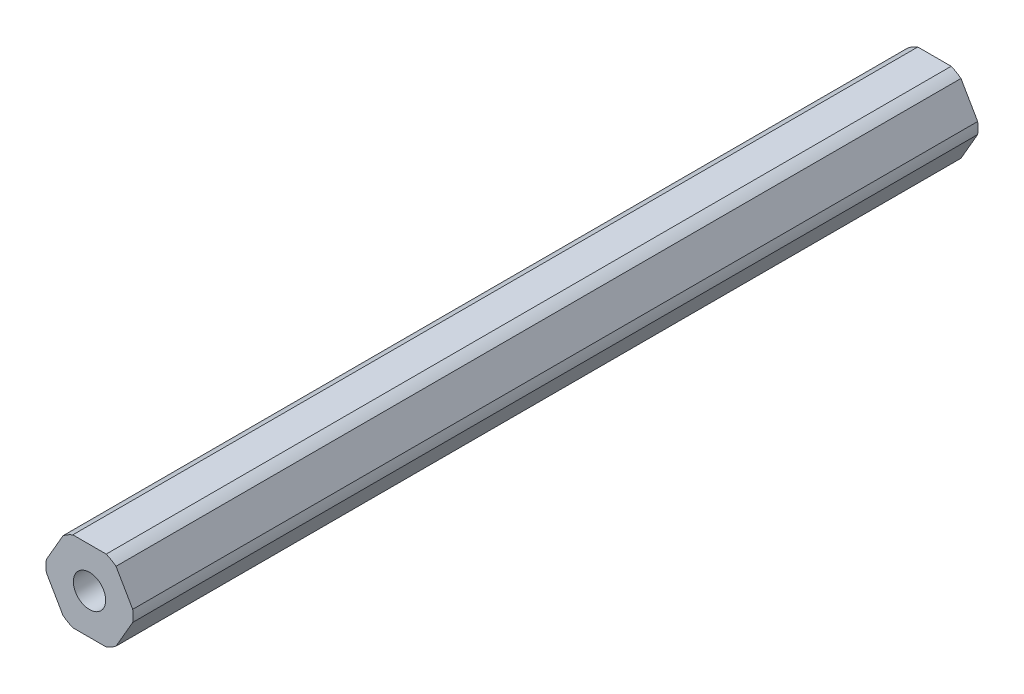
ISO-10303-21;
HEADER;
FILE_DESCRIPTION(('STEP AP214'),'2;1');
FILE_NAME('part.step','',(''),(''),'','','');
FILE_SCHEMA(('AUTOMOTIVE_DESIGN { 1 0 10303 214 1 1 1 1 }'));
ENDSEC;
DATA;
#1=APPLICATION_CONTEXT('core data for automotive mechanical design processes');
#2=APPLICATION_PROTOCOL_DEFINITION('international standard','automotive_design',2000,#1);
#3=PRODUCT_CONTEXT('',#1,'mechanical');
#4=PRODUCT('Part','Part','',(#3));
#5=PRODUCT_RELATED_PRODUCT_CATEGORY('part','',(#4));
#6=PRODUCT_DEFINITION_FORMATION('','',#4);
#7=PRODUCT_DEFINITION_CONTEXT('part definition',#1,'design');
#8=PRODUCT_DEFINITION('design','',#6,#7);
#9=PRODUCT_DEFINITION_SHAPE('','',#8);
#10=(LENGTH_UNIT() NAMED_UNIT(*) SI_UNIT(.MILLI.,.METRE.));
#11=(NAMED_UNIT(*) PLANE_ANGLE_UNIT() SI_UNIT($,.RADIAN.));
#12=(NAMED_UNIT(*) SI_UNIT($,.STERADIAN.) SOLID_ANGLE_UNIT());
#13=UNCERTAINTY_MEASURE_WITH_UNIT(LENGTH_MEASURE(1.E-05),#10,'distance_accuracy_value','');
#14=(GEOMETRIC_REPRESENTATION_CONTEXT(3) GLOBAL_UNCERTAINTY_ASSIGNED_CONTEXT((#13)) GLOBAL_UNIT_ASSIGNED_CONTEXT((#10,
#11,#12)) REPRESENTATION_CONTEXT('',''));
#15=CARTESIAN_POINT('',(0.,0.,0.));
#16=DIRECTION('',(0.,0.,1.));
#17=DIRECTION('',(1.,0.,0.));
#18=AXIS2_PLACEMENT_3D('',#15,#16,#17);
#19=CARTESIAN_POINT('',(0.,0.,133.35));
#20=DIRECTION('',(0.,0.,1.));
#21=DIRECTION('',(1.,0.,0.));
#22=AXIS2_PLACEMENT_3D('',#19,#20,#21);
#23=PLANE('',#22);
#24=CARTESIAN_POINT('',(0.,0.,133.35));
#25=DIRECTION('',(0.,0.,1.));
#26=DIRECTION('',(1.,0.,0.));
#27=AXIS2_PLACEMENT_3D('',#24,#25,#26);
#28=CIRCLE('',#27,6.875);
#29=CARTESIAN_POINT('',(-2.63498102459961,6.35,133.35));
#30=VERTEX_POINT('',#29);
#31=CARTESIAN_POINT('',(-4.18177080173138,5.45696050579321,133.35));
#32=VERTEX_POINT('',#31);
#33=EDGE_CURVE('E176',#30,#32,#28,.T.);
#34=ORIENTED_EDGE('',*,*,#33,.T.);
#35=DIRECTION('',(-0.5,-0.866025403784439,0.));
#36=VECTOR('',#35,1.);
#37=CARTESIAN_POINT('',(-4.18177080173138,5.45696050579321,133.35));
#38=LINE('',#37,#36);
#39=CARTESIAN_POINT('',(-6.81675182633099,0.893039494206796,133.35));
#40=VERTEX_POINT('',#39);
#41=EDGE_CURVE('E104',#32,#40,#38,.T.);
#42=ORIENTED_EDGE('',*,*,#41,.T.);
#43=CARTESIAN_POINT('',(0.,0.,133.35));
#44=DIRECTION('',(0.,0.,1.));
#45=DIRECTION('',(1.,0.,0.));
#46=AXIS2_PLACEMENT_3D('',#43,#44,#45);
#47=CIRCLE('',#46,6.875);
#48=CARTESIAN_POINT('',(-6.81675182633099,-0.893039494206789,133.35));
#49=VERTEX_POINT('',#48);
#50=EDGE_CURVE('E203',#40,#49,#47,.T.);
#51=ORIENTED_EDGE('',*,*,#50,.T.);
#52=DIRECTION('',(0.5,-0.866025403784438,0.));
#53=VECTOR('',#52,1.);
#54=CARTESIAN_POINT('',(-6.81675182633099,-0.893039494206789,133.35));
#55=LINE('',#54,#53);
#56=CARTESIAN_POINT('',(-4.18177080173138,-5.45696050579321,133.35));
#57=VERTEX_POINT('',#56);
#58=EDGE_CURVE('E222',#49,#57,#55,.T.);
#59=ORIENTED_EDGE('',*,*,#58,.T.);
#60=CARTESIAN_POINT('',(0.,0.,133.35));
#61=DIRECTION('',(0.,0.,1.));
#62=DIRECTION('',(1.,0.,0.));
#63=AXIS2_PLACEMENT_3D('',#60,#61,#62);
#64=CIRCLE('',#63,6.875);
#65=CARTESIAN_POINT('',(-2.63498102459961,-6.35,133.35));
#66=VERTEX_POINT('',#65);
#67=EDGE_CURVE('E219',#57,#66,#64,.T.);
#68=ORIENTED_EDGE('',*,*,#67,.T.);
#69=DIRECTION('',(1.,0.,0.));
#70=VECTOR('',#69,1.);
#71=CARTESIAN_POINT('',(-2.63498102459961,-6.35,133.35));
#72=LINE('',#71,#70);
#73=CARTESIAN_POINT('',(2.63498102459961,-6.35,133.35));
#74=VERTEX_POINT('',#73);
#75=EDGE_CURVE('E221',#66,#74,#72,.T.);
#76=ORIENTED_EDGE('',*,*,#75,.T.);
#77=CARTESIAN_POINT('',(0.,0.,133.35));
#78=DIRECTION('',(0.,0.,1.));
#79=DIRECTION('',(1.,0.,0.));
#80=AXIS2_PLACEMENT_3D('',#77,#78,#79);
#81=CIRCLE('',#80,6.875);
#82=CARTESIAN_POINT('',(4.18177080173138,-5.45696050579321,133.35));
#83=VERTEX_POINT('',#82);
#84=EDGE_CURVE('E224',#74,#83,#81,.T.);
#85=ORIENTED_EDGE('',*,*,#84,.T.);
#86=DIRECTION('',(0.5,0.866025403784439,0.));
#87=VECTOR('',#86,1.);
#88=CARTESIAN_POINT('',(4.18177080173138,-5.45696050579321,133.35));
#89=LINE('',#88,#87);
#90=CARTESIAN_POINT('',(6.81675182633099,-0.893039494206794,133.35));
#91=VERTEX_POINT('',#90);
#92=EDGE_CURVE('E230',#83,#91,#89,.T.);
#93=ORIENTED_EDGE('',*,*,#92,.T.);
#94=CARTESIAN_POINT('',(0.,0.,133.35));
#95=DIRECTION('',(0.,0.,1.));
#96=DIRECTION('',(1.,0.,0.));
#97=AXIS2_PLACEMENT_3D('',#94,#95,#96);
#98=CIRCLE('',#97,6.875);
#99=CARTESIAN_POINT('',(6.81675182633099,0.893039494206791,133.35));
#100=VERTEX_POINT('',#99);
#101=EDGE_CURVE('E135',#91,#100,#98,.T.);
#102=ORIENTED_EDGE('',*,*,#101,.T.);
#103=DIRECTION('',(-0.5,0.866025403784439,0.));
#104=VECTOR('',#103,1.);
#105=CARTESIAN_POINT('',(6.81675182633099,0.893039494206791,133.35));
#106=LINE('',#105,#104);
#107=CARTESIAN_POINT('',(4.18177080173138,5.45696050579321,133.35));
#108=VERTEX_POINT('',#107);
#109=EDGE_CURVE('E129',#100,#108,#106,.T.);
#110=ORIENTED_EDGE('',*,*,#109,.T.);
#111=CARTESIAN_POINT('',(0.,0.,133.35));
#112=DIRECTION('',(0.,0.,1.));
#113=DIRECTION('',(1.,0.,0.));
#114=AXIS2_PLACEMENT_3D('',#111,#112,#113);
#115=CIRCLE('',#114,6.875);
#116=CARTESIAN_POINT('',(2.6349810245996,6.35,133.35));
#117=VERTEX_POINT('',#116);
#118=EDGE_CURVE('E133',#108,#117,#115,.T.);
#119=ORIENTED_EDGE('',*,*,#118,.T.);
#120=DIRECTION('',(-1.,0.,0.));
#121=VECTOR('',#120,1.);
#122=CARTESIAN_POINT('',(2.6349810245996,6.35,133.35));
#123=LINE('',#122,#121);
#124=EDGE_CURVE('E49',#117,#30,#123,.T.);
#125=ORIENTED_EDGE('',*,*,#124,.T.);
#126=EDGE_LOOP('',(#34,#42,#51,#59,#68,#76,#85,#93,#102,#110,#119,#125));
#127=FACE_BOUND('',#126,.T.);
#128=CARTESIAN_POINT('',(0.,0.,133.35));
#129=DIRECTION('',(0.,0.,1.));
#130=DIRECTION('',(1.,0.,0.));
#131=AXIS2_PLACEMENT_3D('',#128,#129,#130);
#132=CIRCLE('',#131,2.55);
#133=CARTESIAN_POINT('',(2.55,0.,133.35));
#134=VERTEX_POINT('',#133);
#135=EDGE_CURVE('E157',#134,#134,#132,.T.);
#136=ORIENTED_EDGE('',*,*,#135,.F.);
#137=EDGE_LOOP('',(#136));
#138=FACE_BOUND('',#137,.T.);
#139=ADVANCED_FACE('F32',(#127,#138),#23,.T.);
#140=CARTESIAN_POINT('',(0.,0.,0.));
#141=DIRECTION('',(0.,0.,1.));
#142=DIRECTION('',(1.,0.,0.));
#143=AXIS2_PLACEMENT_3D('',#140,#141,#142);
#144=PLANE('',#143);
#145=CARTESIAN_POINT('',(0.,0.,0.));
#146=DIRECTION('',(0.,0.,1.));
#147=DIRECTION('',(1.,0.,0.));
#148=AXIS2_PLACEMENT_3D('',#145,#146,#147);
#149=CIRCLE('',#148,6.875);
#150=CARTESIAN_POINT('',(-2.63498102459961,6.35,0.));
#151=VERTEX_POINT('',#150);
#152=CARTESIAN_POINT('',(-4.18177080173138,5.45696050579321,0.));
#153=VERTEX_POINT('',#152);
#154=EDGE_CURVE('E153',#151,#153,#149,.T.);
#155=ORIENTED_EDGE('',*,*,#154,.F.);
#156=DIRECTION('',(-1.,0.,0.));
#157=VECTOR('',#156,1.);
#158=CARTESIAN_POINT('',(2.6349810245996,6.35,0.));
#159=LINE('',#158,#157);
#160=CARTESIAN_POINT('',(2.6349810245996,6.35,0.));
#161=VERTEX_POINT('',#160);
#162=EDGE_CURVE('E96',#161,#151,#159,.T.);
#163=ORIENTED_EDGE('',*,*,#162,.F.);
#164=CARTESIAN_POINT('',(0.,0.,0.));
#165=DIRECTION('',(0.,0.,1.));
#166=DIRECTION('',(1.,0.,0.));
#167=AXIS2_PLACEMENT_3D('',#164,#165,#166);
#168=CIRCLE('',#167,6.875);
#169=CARTESIAN_POINT('',(4.18177080173138,5.45696050579321,0.));
#170=VERTEX_POINT('',#169);
#171=EDGE_CURVE('E90',#170,#161,#168,.T.);
#172=ORIENTED_EDGE('',*,*,#171,.F.);
#173=DIRECTION('',(-0.5,0.866025403784439,0.));
#174=VECTOR('',#173,1.);
#175=CARTESIAN_POINT('',(6.81675182633099,0.893039494206791,0.));
#176=LINE('',#175,#174);
#177=CARTESIAN_POINT('',(6.81675182633099,0.893039494206791,0.));
#178=VERTEX_POINT('',#177);
#179=EDGE_CURVE('E143',#178,#170,#176,.T.);
#180=ORIENTED_EDGE('',*,*,#179,.F.);
#181=CARTESIAN_POINT('',(0.,0.,0.));
#182=DIRECTION('',(0.,0.,1.));
#183=DIRECTION('',(1.,0.,0.));
#184=AXIS2_PLACEMENT_3D('',#181,#182,#183);
#185=CIRCLE('',#184,6.875);
#186=CARTESIAN_POINT('',(6.81675182633099,-0.893039494206794,0.));
#187=VERTEX_POINT('',#186);
#188=EDGE_CURVE('E171',#187,#178,#185,.T.);
#189=ORIENTED_EDGE('',*,*,#188,.F.);
#190=DIRECTION('',(0.5,0.866025403784439,0.));
#191=VECTOR('',#190,1.);
#192=CARTESIAN_POINT('',(4.18177080173138,-5.45696050579321,0.));
#193=LINE('',#192,#191);
#194=CARTESIAN_POINT('',(4.18177080173138,-5.45696050579321,0.));
#195=VERTEX_POINT('',#194);
#196=EDGE_CURVE('E169',#195,#187,#193,.T.);
#197=ORIENTED_EDGE('',*,*,#196,.F.);
#198=CARTESIAN_POINT('',(0.,0.,0.));
#199=DIRECTION('',(0.,0.,1.));
#200=DIRECTION('',(1.,0.,0.));
#201=AXIS2_PLACEMENT_3D('',#198,#199,#200);
#202=CIRCLE('',#201,6.875);
#203=CARTESIAN_POINT('',(2.63498102459961,-6.35,0.));
#204=VERTEX_POINT('',#203);
#205=EDGE_CURVE('E167',#204,#195,#202,.T.);
#206=ORIENTED_EDGE('',*,*,#205,.F.);
#207=DIRECTION('',(1.,0.,0.));
#208=VECTOR('',#207,1.);
#209=CARTESIAN_POINT('',(-2.63498102459961,-6.35,0.));
#210=LINE('',#209,#208);
#211=CARTESIAN_POINT('',(-2.63498102459961,-6.35,0.));
#212=VERTEX_POINT('',#211);
#213=EDGE_CURVE('E165',#212,#204,#210,.T.);
#214=ORIENTED_EDGE('',*,*,#213,.F.);
#215=CARTESIAN_POINT('',(0.,0.,0.));
#216=DIRECTION('',(0.,0.,1.));
#217=DIRECTION('',(1.,0.,0.));
#218=AXIS2_PLACEMENT_3D('',#215,#216,#217);
#219=CIRCLE('',#218,6.875);
#220=CARTESIAN_POINT('',(-4.18177080173138,-5.45696050579321,0.));
#221=VERTEX_POINT('',#220);
#222=EDGE_CURVE('E163',#221,#212,#219,.T.);
#223=ORIENTED_EDGE('',*,*,#222,.F.);
#224=DIRECTION('',(0.5,-0.866025403784438,0.));
#225=VECTOR('',#224,1.);
#226=CARTESIAN_POINT('',(-6.81675182633099,-0.893039494206789,0.));
#227=LINE('',#226,#225);
#228=CARTESIAN_POINT('',(-6.81675182633099,-0.893039494206789,0.));
#229=VERTEX_POINT('',#228);
#230=EDGE_CURVE('E161',#229,#221,#227,.T.);
#231=ORIENTED_EDGE('',*,*,#230,.F.);
#232=CARTESIAN_POINT('',(0.,0.,0.));
#233=DIRECTION('',(0.,0.,1.));
#234=DIRECTION('',(1.,0.,0.));
#235=AXIS2_PLACEMENT_3D('',#232,#233,#234);
#236=CIRCLE('',#235,6.875);
#237=CARTESIAN_POINT('',(-6.81675182633099,0.893039494206796,0.));
#238=VERTEX_POINT('',#237);
#239=EDGE_CURVE('E159',#238,#229,#236,.T.);
#240=ORIENTED_EDGE('',*,*,#239,.F.);
#241=DIRECTION('',(-0.5,-0.866025403784439,0.));
#242=VECTOR('',#241,1.);
#243=CARTESIAN_POINT('',(-4.18177080173138,5.45696050579321,0.));
#244=LINE('',#243,#242);
#245=EDGE_CURVE('E156',#153,#238,#244,.T.);
#246=ORIENTED_EDGE('',*,*,#245,.F.);
#247=EDGE_LOOP('',(#155,#163,#172,#180,#189,#197,#206,#214,#223,#231,#240,#246));
#248=FACE_BOUND('',#247,.T.);
#249=CARTESIAN_POINT('',(0.,0.,0.));
#250=DIRECTION('',(0.,0.,1.));
#251=DIRECTION('',(1.,0.,0.));
#252=AXIS2_PLACEMENT_3D('',#249,#250,#251);
#253=CIRCLE('',#252,2.55);
#254=CARTESIAN_POINT('',(2.55,0.,0.));
#255=VERTEX_POINT('',#254);
#256=EDGE_CURVE('E377',#255,#255,#253,.T.);
#257=ORIENTED_EDGE('',*,*,#256,.T.);
#258=EDGE_LOOP('',(#257));
#259=FACE_BOUND('',#258,.T.);
#260=ADVANCED_FACE('F207',(#248,#259),#144,.F.);
#261=CARTESIAN_POINT('',(0.,0.,133.35));
#262=DIRECTION('',(0.,0.,-1.));
#263=DIRECTION('',(-1.,0.,0.));
#264=AXIS2_PLACEMENT_3D('',#261,#262,#263);
#265=CYLINDRICAL_SURFACE('',#264,6.875);
#266=ORIENTED_EDGE('',*,*,#154,.T.);
#267=DIRECTION('',(0.,0.,-1.));
#268=VECTOR('',#267,1.);
#269=CARTESIAN_POINT('',(-4.18177080173138,5.45696050579321,133.35));
#270=LINE('',#269,#268);
#271=EDGE_CURVE('E11',#32,#153,#270,.T.);
#272=ORIENTED_EDGE('',*,*,#271,.F.);
#273=ORIENTED_EDGE('',*,*,#33,.F.);
#274=DIRECTION('',(0.,0.,-1.));
#275=VECTOR('',#274,1.);
#276=CARTESIAN_POINT('',(-2.63498102459961,6.35,133.35));
#277=LINE('',#276,#275);
#278=EDGE_CURVE('E149',#30,#151,#277,.T.);
#279=ORIENTED_EDGE('',*,*,#278,.T.);
#280=EDGE_LOOP('',(#266,#272,#273,#279));
#281=FACE_BOUND('',#280,.T.);
#282=ADVANCED_FACE('F34',(#281),#265,.T.);
#283=CARTESIAN_POINT('',(-4.18177080173138,5.45696050579321,133.35));
#284=DIRECTION('',(0.866025403784439,-0.5,0.));
#285=DIRECTION('',(0.5,0.866025403784439,0.));
#286=AXIS2_PLACEMENT_3D('',#283,#284,#285);
#287=PLANE('',#286);
#288=ORIENTED_EDGE('',*,*,#245,.T.);
#289=DIRECTION('',(0.,0.,-1.));
#290=VECTOR('',#289,1.);
#291=CARTESIAN_POINT('',(-6.81675182633099,0.893039494206796,133.35));
#292=LINE('',#291,#290);
#293=EDGE_CURVE('E41',#40,#238,#292,.T.);
#294=ORIENTED_EDGE('',*,*,#293,.F.);
#295=ORIENTED_EDGE('',*,*,#41,.F.);
#296=ORIENTED_EDGE('',*,*,#271,.T.);
#297=EDGE_LOOP('',(#288,#294,#295,#296));
#298=FACE_BOUND('',#297,.T.);
#299=ADVANCED_FACE('F264',(#298),#287,.F.);
#300=CARTESIAN_POINT('',(0.,0.,133.35));
#301=DIRECTION('',(0.,0.,-1.));
#302=DIRECTION('',(-1.,0.,0.));
#303=AXIS2_PLACEMENT_3D('',#300,#301,#302);
#304=CYLINDRICAL_SURFACE('',#303,6.875);
#305=ORIENTED_EDGE('',*,*,#239,.T.);
#306=DIRECTION('',(0.,0.,-1.));
#307=VECTOR('',#306,1.);
#308=CARTESIAN_POINT('',(-6.81675182633099,-0.893039494206789,133.35));
#309=LINE('',#308,#307);
#310=EDGE_CURVE('E195',#49,#229,#309,.T.);
#311=ORIENTED_EDGE('',*,*,#310,.F.);
#312=ORIENTED_EDGE('',*,*,#50,.F.);
#313=ORIENTED_EDGE('',*,*,#293,.T.);
#314=EDGE_LOOP('',(#305,#311,#312,#313));
#315=FACE_BOUND('',#314,.T.);
#316=ADVANCED_FACE('F201',(#315),#304,.T.);
#317=CARTESIAN_POINT('',(-6.81675182633099,-0.893039494206789,133.35));
#318=DIRECTION('',(0.866025403784439,0.5,0.));
#319=DIRECTION('',(-0.5,0.866025403784438,0.));
#320=AXIS2_PLACEMENT_3D('',#317,#318,#319);
#321=PLANE('',#320);
#322=ORIENTED_EDGE('',*,*,#230,.T.);
#323=DIRECTION('',(0.,0.,-1.));
#324=VECTOR('',#323,1.);
#325=CARTESIAN_POINT('',(-4.18177080173138,-5.45696050579321,133.35));
#326=LINE('',#325,#324);
#327=EDGE_CURVE('E192',#57,#221,#326,.T.);
#328=ORIENTED_EDGE('',*,*,#327,.F.);
#329=ORIENTED_EDGE('',*,*,#58,.F.);
#330=ORIENTED_EDGE('',*,*,#310,.T.);
#331=EDGE_LOOP('',(#322,#328,#329,#330));
#332=FACE_BOUND('',#331,.T.);
#333=ADVANCED_FACE('F213',(#332),#321,.F.);
#334=CARTESIAN_POINT('',(0.,0.,133.35));
#335=DIRECTION('',(0.,0.,-1.));
#336=DIRECTION('',(-1.,0.,0.));
#337=AXIS2_PLACEMENT_3D('',#334,#335,#336);
#338=CYLINDRICAL_SURFACE('',#337,6.875);
#339=ORIENTED_EDGE('',*,*,#222,.T.);
#340=DIRECTION('',(0.,0.,-1.));
#341=VECTOR('',#340,1.);
#342=CARTESIAN_POINT('',(-2.63498102459961,-6.35,133.35));
#343=LINE('',#342,#341);
#344=EDGE_CURVE('E189',#66,#212,#343,.T.);
#345=ORIENTED_EDGE('',*,*,#344,.F.);
#346=ORIENTED_EDGE('',*,*,#67,.F.);
#347=ORIENTED_EDGE('',*,*,#327,.T.);
#348=EDGE_LOOP('',(#339,#345,#346,#347));
#349=FACE_BOUND('',#348,.T.);
#350=ADVANCED_FACE('F217',(#349),#338,.T.);
#351=CARTESIAN_POINT('',(-2.63498102459961,-6.35,133.35));
#352=DIRECTION('',(0.,1.,0.));
#353=DIRECTION('',(0.,0.,1.));
#354=AXIS2_PLACEMENT_3D('',#351,#352,#353);
#355=PLANE('',#354);
#356=ORIENTED_EDGE('',*,*,#213,.T.);
#357=DIRECTION('',(0.,0.,-1.));
#358=VECTOR('',#357,1.);
#359=CARTESIAN_POINT('',(2.63498102459961,-6.35,133.35));
#360=LINE('',#359,#358);
#361=EDGE_CURVE('E186',#74,#204,#360,.T.);
#362=ORIENTED_EDGE('',*,*,#361,.F.);
#363=ORIENTED_EDGE('',*,*,#75,.F.);
#364=ORIENTED_EDGE('',*,*,#344,.T.);
#365=EDGE_LOOP('',(#356,#362,#363,#364));
#366=FACE_BOUND('',#365,.T.);
#367=ADVANCED_FACE('F277',(#366),#355,.F.);
#368=CARTESIAN_POINT('',(0.,0.,133.35));
#369=DIRECTION('',(0.,0.,-1.));
#370=DIRECTION('',(-1.,0.,0.));
#371=AXIS2_PLACEMENT_3D('',#368,#369,#370);
#372=CYLINDRICAL_SURFACE('',#371,6.875);
#373=ORIENTED_EDGE('',*,*,#205,.T.);
#374=DIRECTION('',(0.,0.,-1.));
#375=VECTOR('',#374,1.);
#376=CARTESIAN_POINT('',(4.18177080173138,-5.45696050579321,133.35));
#377=LINE('',#376,#375);
#378=EDGE_CURVE('E183',#83,#195,#377,.T.);
#379=ORIENTED_EDGE('',*,*,#378,.F.);
#380=ORIENTED_EDGE('',*,*,#84,.F.);
#381=ORIENTED_EDGE('',*,*,#361,.T.);
#382=EDGE_LOOP('',(#373,#379,#380,#381));
#383=FACE_BOUND('',#382,.T.);
#384=ADVANCED_FACE('F280',(#383),#372,.T.);
#385=CARTESIAN_POINT('',(4.18177080173138,-5.45696050579321,133.35));
#386=DIRECTION('',(-0.866025403784439,0.5,0.));
#387=DIRECTION('',(-0.5,-0.866025403784439,0.));
#388=AXIS2_PLACEMENT_3D('',#385,#386,#387);
#389=PLANE('',#388);
#390=ORIENTED_EDGE('',*,*,#196,.T.);
#391=DIRECTION('',(0.,0.,-1.));
#392=VECTOR('',#391,1.);
#393=CARTESIAN_POINT('',(6.81675182633099,-0.893039494206794,133.35));
#394=LINE('',#393,#392);
#395=EDGE_CURVE('E180',#91,#187,#394,.T.);
#396=ORIENTED_EDGE('',*,*,#395,.F.);
#397=ORIENTED_EDGE('',*,*,#92,.F.);
#398=ORIENTED_EDGE('',*,*,#378,.T.);
#399=EDGE_LOOP('',(#390,#396,#397,#398));
#400=FACE_BOUND('',#399,.T.);
#401=ADVANCED_FACE('F236',(#400),#389,.F.);
#402=CARTESIAN_POINT('',(0.,0.,133.35));
#403=DIRECTION('',(0.,0.,-1.));
#404=DIRECTION('',(-1.,0.,0.));
#405=AXIS2_PLACEMENT_3D('',#402,#403,#404);
#406=CYLINDRICAL_SURFACE('',#405,6.875);
#407=ORIENTED_EDGE('',*,*,#188,.T.);
#408=DIRECTION('',(0.,0.,-1.));
#409=VECTOR('',#408,1.);
#410=CARTESIAN_POINT('',(6.81675182633099,0.893039494206791,133.35));
#411=LINE('',#410,#409);
#412=EDGE_CURVE('E144',#100,#178,#411,.T.);
#413=ORIENTED_EDGE('',*,*,#412,.F.);
#414=ORIENTED_EDGE('',*,*,#101,.F.);
#415=ORIENTED_EDGE('',*,*,#395,.T.);
#416=EDGE_LOOP('',(#407,#413,#414,#415));
#417=FACE_BOUND('',#416,.T.);
#418=ADVANCED_FACE('F240',(#417),#406,.T.);
#419=CARTESIAN_POINT('',(6.81675182633099,0.893039494206791,133.35));
#420=DIRECTION('',(-0.866025403784438,-0.5,0.));
#421=DIRECTION('',(0.5,-0.866025403784439,0.));
#422=AXIS2_PLACEMENT_3D('',#419,#420,#421);
#423=PLANE('',#422);
#424=ORIENTED_EDGE('',*,*,#179,.T.);
#425=DIRECTION('',(0.,0.,-1.));
#426=VECTOR('',#425,1.);
#427=CARTESIAN_POINT('',(4.18177080173138,5.45696050579321,133.35));
#428=LINE('',#427,#426);
#429=EDGE_CURVE('E140',#108,#170,#428,.T.);
#430=ORIENTED_EDGE('',*,*,#429,.F.);
#431=ORIENTED_EDGE('',*,*,#109,.F.);
#432=ORIENTED_EDGE('',*,*,#412,.T.);
#433=EDGE_LOOP('',(#424,#430,#431,#432));
#434=FACE_BOUND('',#433,.T.);
#435=ADVANCED_FACE('F141',(#434),#423,.F.);
#436=CARTESIAN_POINT('',(0.,0.,133.35));
#437=DIRECTION('',(0.,0.,-1.));
#438=DIRECTION('',(-1.,0.,0.));
#439=AXIS2_PLACEMENT_3D('',#436,#437,#438);
#440=CYLINDRICAL_SURFACE('',#439,6.875);
#441=ORIENTED_EDGE('',*,*,#171,.T.);
#442=DIRECTION('',(0.,0.,-1.));
#443=VECTOR('',#442,1.);
#444=CARTESIAN_POINT('',(2.6349810245996,6.35,133.35));
#445=LINE('',#444,#443);
#446=EDGE_CURVE('E145',#117,#161,#445,.T.);
#447=ORIENTED_EDGE('',*,*,#446,.F.);
#448=ORIENTED_EDGE('',*,*,#118,.F.);
#449=ORIENTED_EDGE('',*,*,#429,.T.);
#450=EDGE_LOOP('',(#441,#447,#448,#449));
#451=FACE_BOUND('',#450,.T.);
#452=ADVANCED_FACE('F147',(#451),#440,.T.);
#453=CARTESIAN_POINT('',(2.6349810245996,6.35,133.35));
#454=DIRECTION('',(0.,-1.,0.));
#455=DIRECTION('',(1.,0.,0.));
#456=AXIS2_PLACEMENT_3D('',#453,#454,#455);
#457=PLANE('',#456);
#458=ORIENTED_EDGE('',*,*,#162,.T.);
#459=ORIENTED_EDGE('',*,*,#278,.F.);
#460=ORIENTED_EDGE('',*,*,#124,.F.);
#461=ORIENTED_EDGE('',*,*,#446,.T.);
#462=EDGE_LOOP('',(#458,#459,#460,#461));
#463=FACE_BOUND('',#462,.T.);
#464=ADVANCED_FACE('F244',(#463),#457,.F.);
#465=CARTESIAN_POINT('',(0.,0.,133.35));
#466=DIRECTION('',(0.,0.,-1.));
#467=DIRECTION('',(-1.,0.,0.));
#468=AXIS2_PLACEMENT_3D('',#465,#466,#467);
#469=CYLINDRICAL_SURFACE('',#468,2.55);
#470=ORIENTED_EDGE('',*,*,#135,.T.);
#471=EDGE_LOOP('',(#470));
#472=FACE_BOUND('',#471,.T.);
#473=ORIENTED_EDGE('',*,*,#256,.F.);
#474=EDGE_LOOP('',(#473));
#475=FACE_BOUND('',#474,.T.);
#476=ADVANCED_FACE('F246',(#472,#475),#469,.F.);
#477=CLOSED_SHELL('',(#139,#260,#282,#299,#316,#333,#350,#367,#384,#401,#418,#435,#452,#464,#476));
#478=MANIFOLD_SOLID_BREP('B2',#477);
#479=ADVANCED_BREP_SHAPE_REPRESENTATION('',(#18,#478),#14);
#480=SHAPE_DEFINITION_REPRESENTATION(#9,#479);
ENDSEC;
END-ISO-10303-21;
